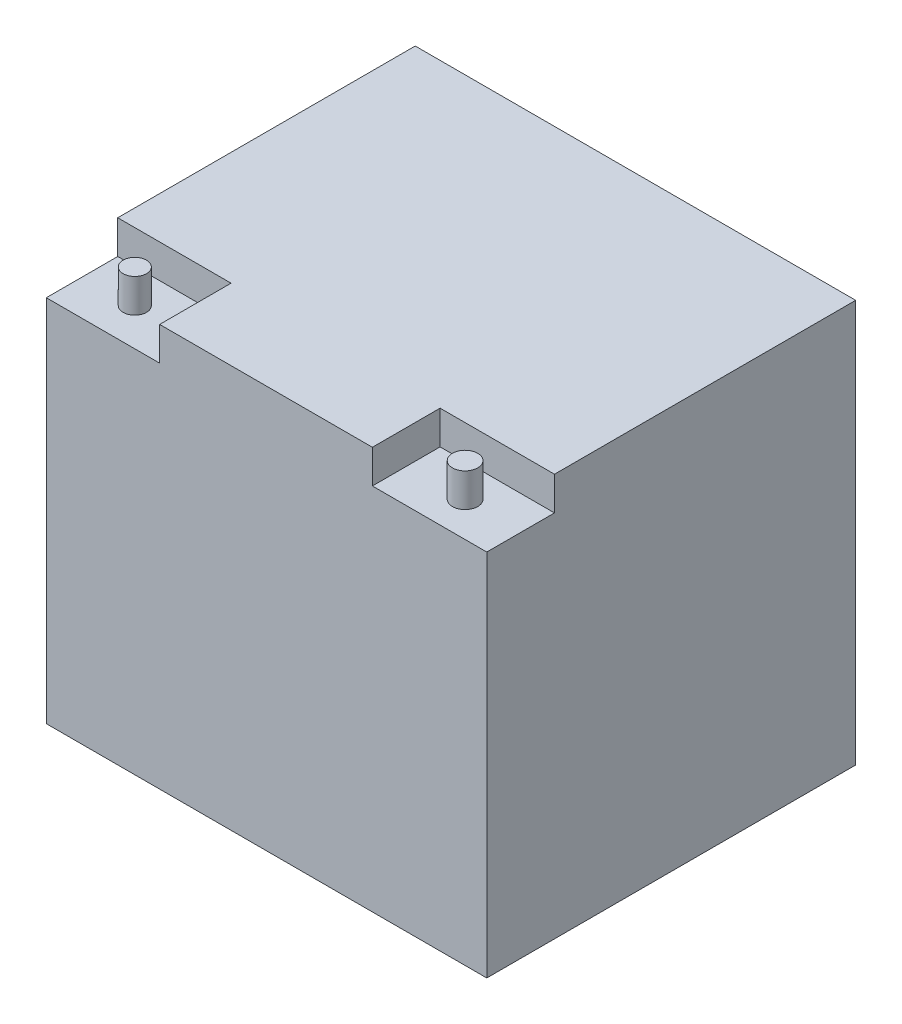
ISO-10303-21;
HEADER;
FILE_DESCRIPTION(('STEP AP214'),'2;1');
FILE_NAME('part.step','',(''),(''),'','','');
FILE_SCHEMA(('AUTOMOTIVE_DESIGN { 1 0 10303 214 1 1 1 1 }'));
ENDSEC;
DATA;
#1=APPLICATION_CONTEXT('core data for automotive mechanical design processes');
#2=APPLICATION_PROTOCOL_DEFINITION('international standard','automotive_design',2000,#1);
#3=PRODUCT_CONTEXT('',#1,'mechanical');
#4=PRODUCT('Part','Part','',(#3));
#5=PRODUCT_RELATED_PRODUCT_CATEGORY('part','',(#4));
#6=PRODUCT_DEFINITION_FORMATION('','',#4);
#7=PRODUCT_DEFINITION_CONTEXT('part definition',#1,'design');
#8=PRODUCT_DEFINITION('design','',#6,#7);
#9=PRODUCT_DEFINITION_SHAPE('','',#8);
#10=(LENGTH_UNIT() NAMED_UNIT(*) SI_UNIT(.MILLI.,.METRE.));
#11=(NAMED_UNIT(*) PLANE_ANGLE_UNIT() SI_UNIT($,.RADIAN.));
#12=(NAMED_UNIT(*) SI_UNIT($,.STERADIAN.) SOLID_ANGLE_UNIT());
#13=UNCERTAINTY_MEASURE_WITH_UNIT(LENGTH_MEASURE(1.E-05),#10,'distance_accuracy_value','');
#14=(GEOMETRIC_REPRESENTATION_CONTEXT(3) GLOBAL_UNCERTAINTY_ASSIGNED_CONTEXT((#13)) GLOBAL_UNIT_ASSIGNED_CONTEXT((#10,
#11,#12)) REPRESENTATION_CONTEXT('',''));
#15=CARTESIAN_POINT('',(0.,0.,0.));
#16=DIRECTION('',(0.,0.,1.));
#17=DIRECTION('',(1.,0.,0.));
#18=AXIS2_PLACEMENT_3D('',#15,#16,#17);
#19=CARTESIAN_POINT('',(0.,165.,0.));
#20=DIRECTION('',(0.,1.,0.));
#21=DIRECTION('',(0.,0.,1.));
#22=AXIS2_PLACEMENT_3D('',#19,#20,#21);
#23=PLANE('',#22);
#24=DIRECTION('',(0.,0.,-1.));
#25=VECTOR('',#24,1.);
#26=CARTESIAN_POINT('',(98.5,165.,82.5));
#27=LINE('',#26,#25);
#28=CARTESIAN_POINT('',(98.5,165.,82.5));
#29=VERTEX_POINT('',#28);
#30=CARTESIAN_POINT('',(98.5,165.,52.2159010639101));
#31=VERTEX_POINT('',#30);
#32=EDGE_CURVE('E122',#29,#31,#27,.T.);
#33=ORIENTED_EDGE('',*,*,#32,.T.);
#34=DIRECTION('',(-1.,0.,0.));
#35=VECTOR('',#34,1.);
#36=CARTESIAN_POINT('',(98.5,165.,52.2159010639101));
#37=LINE('',#36,#35);
#38=CARTESIAN_POINT('',(47.3392451558917,165.,52.2159010639101));
#39=VERTEX_POINT('',#38);
#40=EDGE_CURVE('E114',#31,#39,#37,.T.);
#41=ORIENTED_EDGE('',*,*,#40,.T.);
#42=DIRECTION('',(0.,0.,1.));
#43=VECTOR('',#42,1.);
#44=CARTESIAN_POINT('',(47.3392451558917,165.,82.5));
#45=LINE('',#44,#43);
#46=CARTESIAN_POINT('',(47.3392451558917,165.,82.5));
#47=VERTEX_POINT('',#46);
#48=EDGE_CURVE('E121',#39,#47,#45,.T.);
#49=ORIENTED_EDGE('',*,*,#48,.T.);
#50=DIRECTION('',(1.,0.,0.));
#51=VECTOR('',#50,1.);
#52=CARTESIAN_POINT('',(98.5,165.,82.5));
#53=LINE('',#52,#51);
#54=EDGE_CURVE('E127',#47,#29,#53,.T.);
#55=ORIENTED_EDGE('',*,*,#54,.T.);
#56=EDGE_LOOP('',(#33,#41,#49,#55));
#57=FACE_BOUND('',#56,.T.);
#58=CARTESIAN_POINT('',(73.2281311450694,165.,66.92709969892));
#59=DIRECTION('',(0.,1.,0.));
#60=DIRECTION('',(0.,0.,1.));
#61=AXIS2_PLACEMENT_3D('',#58,#59,#60);
#62=CIRCLE('',#61,5.65349857387054);
#63=CARTESIAN_POINT('',(73.2281311450694,165.,72.5805982727905));
#64=VERTEX_POINT('',#63);
#65=EDGE_CURVE('E276',#64,#64,#62,.T.);
#66=ORIENTED_EDGE('',*,*,#65,.F.);
#67=EDGE_LOOP('',(#66));
#68=FACE_BOUND('',#67,.T.);
#69=ADVANCED_FACE('F37',(#57,#68),#23,.T.);
#70=CARTESIAN_POINT('',(0.,165.,0.));
#71=DIRECTION('',(0.,-1.,0.));
#72=DIRECTION('',(0.,0.,-1.));
#73=AXIS2_PLACEMENT_3D('',#70,#71,#72);
#74=PLANE('',#73);
#75=DIRECTION('',(0.,0.,1.));
#76=VECTOR('',#75,1.);
#77=CARTESIAN_POINT('',(-98.5,165.,82.5));
#78=LINE('',#77,#76);
#79=CARTESIAN_POINT('',(-98.5,165.,50.5507014855621));
#80=VERTEX_POINT('',#79);
#81=CARTESIAN_POINT('',(-98.5,165.,82.5));
#82=VERTEX_POINT('',#81);
#83=EDGE_CURVE('E141',#80,#82,#78,.T.);
#84=ORIENTED_EDGE('',*,*,#83,.T.);
#85=DIRECTION('',(1.,0.,0.));
#86=VECTOR('',#85,1.);
#87=CARTESIAN_POINT('',(-98.5,165.,82.5));
#88=LINE('',#87,#86);
#89=CARTESIAN_POINT('',(-47.8150164639912,165.,82.5));
#90=VERTEX_POINT('',#89);
#91=EDGE_CURVE('E143',#82,#90,#88,.T.);
#92=ORIENTED_EDGE('',*,*,#91,.T.);
#93=DIRECTION('',(0.,0.,-1.));
#94=VECTOR('',#93,1.);
#95=CARTESIAN_POINT('',(-47.8150164639912,165.,82.5));
#96=LINE('',#95,#94);
#97=CARTESIAN_POINT('',(-47.8150164639912,165.,50.5507014855621));
#98=VERTEX_POINT('',#97);
#99=EDGE_CURVE('E147',#90,#98,#96,.T.);
#100=ORIENTED_EDGE('',*,*,#99,.T.);
#101=DIRECTION('',(-1.,0.,0.));
#102=VECTOR('',#101,1.);
#103=CARTESIAN_POINT('',(-98.5,165.,50.5507014855621));
#104=LINE('',#103,#102);
#105=EDGE_CURVE('E150',#98,#80,#104,.T.);
#106=ORIENTED_EDGE('',*,*,#105,.T.);
#107=EDGE_LOOP('',(#84,#92,#100,#106));
#108=FACE_BOUND('',#107,.T.);
#109=CARTESIAN_POINT('',(-75.6476379878069,165.,65.7753833447435));
#110=DIRECTION('',(0.,-1.,0.));
#111=DIRECTION('',(0.,0.,-1.));
#112=AXIS2_PLACEMENT_3D('',#109,#110,#111);
#113=CIRCLE('',#112,5.23888809150268);
#114=CARTESIAN_POINT('',(-75.6476379878069,165.,60.5364952532409));
#115=VERTEX_POINT('',#114);
#116=EDGE_CURVE('E11',#115,#115,#113,.F.);
#117=ORIENTED_EDGE('',*,*,#116,.F.);
#118=EDGE_LOOP('',(#117));
#119=FACE_BOUND('',#118,.T.);
#120=ADVANCED_FACE('F224',(#108,#119),#74,.F.);
#121=CARTESIAN_POINT('',(98.5,180.,-82.5));
#122=DIRECTION('',(-1.,0.,0.));
#123=DIRECTION('',(0.,0.,1.));
#124=AXIS2_PLACEMENT_3D('',#121,#122,#123);
#125=PLANE('',#124);
#126=DIRECTION('',(0.,0.,-1.));
#127=VECTOR('',#126,1.);
#128=CARTESIAN_POINT('',(98.5,180.,-82.5));
#129=LINE('',#128,#127);
#130=CARTESIAN_POINT('',(98.5,180.,52.2159010639101));
#131=VERTEX_POINT('',#130);
#132=CARTESIAN_POINT('',(98.5,180.,-82.5));
#133=VERTEX_POINT('',#132);
#134=EDGE_CURVE('E134',#131,#133,#129,.T.);
#135=ORIENTED_EDGE('',*,*,#134,.F.);
#136=DIRECTION('',(0.,1.,0.));
#137=VECTOR('',#136,1.);
#138=CARTESIAN_POINT('',(98.5,165.,52.2159010639101));
#139=LINE('',#138,#137);
#140=EDGE_CURVE('E52',#31,#131,#139,.T.);
#141=ORIENTED_EDGE('',*,*,#140,.F.);
#142=ORIENTED_EDGE('',*,*,#32,.F.);
#143=DIRECTION('',(0.,-1.,0.));
#144=VECTOR('',#143,1.);
#145=CARTESIAN_POINT('',(98.5,180.,82.5));
#146=LINE('',#145,#144);
#147=CARTESIAN_POINT('',(98.5,0.,82.5));
#148=VERTEX_POINT('',#147);
#149=EDGE_CURVE('E173',#29,#148,#146,.T.);
#150=ORIENTED_EDGE('',*,*,#149,.T.);
#151=DIRECTION('',(0.,0.,-1.));
#152=VECTOR('',#151,1.);
#153=CARTESIAN_POINT('',(98.5,0.,-82.5));
#154=LINE('',#153,#152);
#155=CARTESIAN_POINT('',(98.5,0.,-82.5));
#156=VERTEX_POINT('',#155);
#157=EDGE_CURVE('E159',#148,#156,#154,.T.);
#158=ORIENTED_EDGE('',*,*,#157,.T.);
#159=DIRECTION('',(0.,-1.,0.));
#160=VECTOR('',#159,1.);
#161=CARTESIAN_POINT('',(98.5,180.,-82.5));
#162=LINE('',#161,#160);
#163=EDGE_CURVE('E45',#133,#156,#162,.T.);
#164=ORIENTED_EDGE('',*,*,#163,.F.);
#165=EDGE_LOOP('',(#135,#141,#142,#150,#158,#164));
#166=FACE_BOUND('',#165,.T.);
#167=ADVANCED_FACE('F39',(#166),#125,.F.);
#168=CARTESIAN_POINT('',(-98.5000000000001,180.,-82.5));
#169=DIRECTION('',(0.,0.,1.));
#170=DIRECTION('',(1.,0.,0.));
#171=AXIS2_PLACEMENT_3D('',#168,#169,#170);
#172=PLANE('',#171);
#173=DIRECTION('',(-1.,0.,0.));
#174=VECTOR('',#173,1.);
#175=CARTESIAN_POINT('',(-98.5000000000001,0.,-82.5));
#176=LINE('',#175,#174);
#177=CARTESIAN_POINT('',(-98.5000000000001,0.,-82.5));
#178=VERTEX_POINT('',#177);
#179=EDGE_CURVE('E176',#156,#178,#176,.T.);
#180=ORIENTED_EDGE('',*,*,#179,.T.);
#181=DIRECTION('',(0.,-1.,0.));
#182=VECTOR('',#181,1.);
#183=CARTESIAN_POINT('',(-98.5000000000001,180.,-82.5));
#184=LINE('',#183,#182);
#185=CARTESIAN_POINT('',(-98.5000000000001,180.,-82.5));
#186=VERTEX_POINT('',#185);
#187=EDGE_CURVE('E186',#186,#178,#184,.T.);
#188=ORIENTED_EDGE('',*,*,#187,.F.);
#189=DIRECTION('',(-1.,0.,0.));
#190=VECTOR('',#189,1.);
#191=CARTESIAN_POINT('',(-98.5000000000001,180.,-82.5));
#192=LINE('',#191,#190);
#193=EDGE_CURVE('E164',#133,#186,#192,.T.);
#194=ORIENTED_EDGE('',*,*,#193,.F.);
#195=ORIENTED_EDGE('',*,*,#163,.T.);
#196=EDGE_LOOP('',(#180,#188,#194,#195));
#197=FACE_BOUND('',#196,.T.);
#198=ADVANCED_FACE('F191',(#197),#172,.F.);
#199=CARTESIAN_POINT('',(-98.5000000000001,180.,-82.5));
#200=DIRECTION('',(1.,0.,0.));
#201=DIRECTION('',(0.,0.,-1.));
#202=AXIS2_PLACEMENT_3D('',#199,#200,#201);
#203=PLANE('',#202);
#204=ORIENTED_EDGE('',*,*,#83,.F.);
#205=DIRECTION('',(0.,1.,0.));
#206=VECTOR('',#205,1.);
#207=CARTESIAN_POINT('',(-98.5,165.,50.5507014855621));
#208=LINE('',#207,#206);
#209=CARTESIAN_POINT('',(-98.5,180.,50.5507014855621));
#210=VERTEX_POINT('',#209);
#211=EDGE_CURVE('E156',#80,#210,#208,.T.);
#212=ORIENTED_EDGE('',*,*,#211,.T.);
#213=DIRECTION('',(0.,0.,1.));
#214=VECTOR('',#213,1.);
#215=CARTESIAN_POINT('',(-98.5000000000001,180.,-82.5));
#216=LINE('',#215,#214);
#217=EDGE_CURVE('E167',#186,#210,#216,.T.);
#218=ORIENTED_EDGE('',*,*,#217,.F.);
#219=ORIENTED_EDGE('',*,*,#187,.T.);
#220=DIRECTION('',(0.,0.,1.));
#221=VECTOR('',#220,1.);
#222=CARTESIAN_POINT('',(-98.5000000000001,0.,-82.5));
#223=LINE('',#222,#221);
#224=CARTESIAN_POINT('',(-98.5,0.,82.5));
#225=VERTEX_POINT('',#224);
#226=EDGE_CURVE('E178',#178,#225,#223,.T.);
#227=ORIENTED_EDGE('',*,*,#226,.T.);
#228=DIRECTION('',(0.,-1.,0.));
#229=VECTOR('',#228,1.);
#230=CARTESIAN_POINT('',(-98.5,180.,82.5));
#231=LINE('',#230,#229);
#232=EDGE_CURVE('E184',#82,#225,#231,.T.);
#233=ORIENTED_EDGE('',*,*,#232,.F.);
#234=EDGE_LOOP('',(#204,#212,#218,#219,#227,#233));
#235=FACE_BOUND('',#234,.T.);
#236=ADVANCED_FACE('F201',(#235),#203,.F.);
#237=CARTESIAN_POINT('',(-98.5,180.,82.5));
#238=DIRECTION('',(0.,0.,-1.));
#239=DIRECTION('',(-1.,0.,0.));
#240=AXIS2_PLACEMENT_3D('',#237,#238,#239);
#241=PLANE('',#240);
#242=ORIENTED_EDGE('',*,*,#54,.F.);
#243=DIRECTION('',(0.,1.,0.));
#244=VECTOR('',#243,1.);
#245=CARTESIAN_POINT('',(47.3392451558917,165.,82.5));
#246=LINE('',#245,#244);
#247=CARTESIAN_POINT('',(47.3392451558917,180.,82.5));
#248=VERTEX_POINT('',#247);
#249=EDGE_CURVE('E136',#47,#248,#246,.T.);
#250=ORIENTED_EDGE('',*,*,#249,.T.);
#251=DIRECTION('',(1.,0.,0.));
#252=VECTOR('',#251,1.);
#253=CARTESIAN_POINT('',(-98.5,180.,82.5));
#254=LINE('',#253,#252);
#255=CARTESIAN_POINT('',(-47.8150164639912,180.,82.5));
#256=VERTEX_POINT('',#255);
#257=EDGE_CURVE('E170',#256,#248,#254,.T.);
#258=ORIENTED_EDGE('',*,*,#257,.F.);
#259=DIRECTION('',(0.,1.,0.));
#260=VECTOR('',#259,1.);
#261=CARTESIAN_POINT('',(-47.8150164639912,165.,82.5));
#262=LINE('',#261,#260);
#263=EDGE_CURVE('E60',#90,#256,#262,.T.);
#264=ORIENTED_EDGE('',*,*,#263,.F.);
#265=ORIENTED_EDGE('',*,*,#91,.F.);
#266=ORIENTED_EDGE('',*,*,#232,.T.);
#267=DIRECTION('',(1.,0.,0.));
#268=VECTOR('',#267,1.);
#269=CARTESIAN_POINT('',(-98.5,0.,82.5));
#270=LINE('',#269,#268);
#271=EDGE_CURVE('E165',#225,#148,#270,.T.);
#272=ORIENTED_EDGE('',*,*,#271,.T.);
#273=ORIENTED_EDGE('',*,*,#149,.F.);
#274=EDGE_LOOP('',(#242,#250,#258,#264,#265,#266,#272,#273));
#275=FACE_BOUND('',#274,.T.);
#276=ADVANCED_FACE('F218',(#275),#241,.F.);
#277=CARTESIAN_POINT('',(0.,180.,0.));
#278=DIRECTION('',(0.,1.,0.));
#279=DIRECTION('',(0.,0.,1.));
#280=AXIS2_PLACEMENT_3D('',#277,#278,#279);
#281=PLANE('',#280);
#282=DIRECTION('',(0.,0.,1.));
#283=VECTOR('',#282,1.);
#284=CARTESIAN_POINT('',(47.3392451558917,180.,82.5));
#285=LINE('',#284,#283);
#286=CARTESIAN_POINT('',(47.3392451558917,180.,52.2159010639101));
#287=VERTEX_POINT('',#286);
#288=EDGE_CURVE('E130',#287,#248,#285,.T.);
#289=ORIENTED_EDGE('',*,*,#288,.F.);
#290=DIRECTION('',(-1.,0.,0.));
#291=VECTOR('',#290,1.);
#292=CARTESIAN_POINT('',(98.5,180.,52.2159010639101));
#293=LINE('',#292,#291);
#294=EDGE_CURVE('E207',#131,#287,#293,.T.);
#295=ORIENTED_EDGE('',*,*,#294,.F.);
#296=ORIENTED_EDGE('',*,*,#134,.T.);
#297=ORIENTED_EDGE('',*,*,#193,.T.);
#298=ORIENTED_EDGE('',*,*,#217,.T.);
#299=DIRECTION('',(-1.,0.,0.));
#300=VECTOR('',#299,1.);
#301=CARTESIAN_POINT('',(-98.5,180.,50.5507014855621));
#302=LINE('',#301,#300);
#303=CARTESIAN_POINT('',(-47.8150164639912,180.,50.5507014855621));
#304=VERTEX_POINT('',#303);
#305=EDGE_CURVE('E144',#304,#210,#302,.T.);
#306=ORIENTED_EDGE('',*,*,#305,.F.);
#307=DIRECTION('',(0.,0.,-1.));
#308=VECTOR('',#307,1.);
#309=CARTESIAN_POINT('',(-47.8150164639912,180.,82.5));
#310=LINE('',#309,#308);
#311=EDGE_CURVE('E153',#256,#304,#310,.T.);
#312=ORIENTED_EDGE('',*,*,#311,.F.);
#313=ORIENTED_EDGE('',*,*,#257,.T.);
#314=EDGE_LOOP('',(#289,#295,#296,#297,#298,#306,#312,#313));
#315=FACE_BOUND('',#314,.T.);
#316=ADVANCED_FACE('F206',(#315),#281,.T.);
#317=CARTESIAN_POINT('',(0.,0.,0.));
#318=DIRECTION('',(0.,1.,0.));
#319=DIRECTION('',(0.,0.,1.));
#320=AXIS2_PLACEMENT_3D('',#317,#318,#319);
#321=PLANE('',#320);
#322=ORIENTED_EDGE('',*,*,#157,.F.);
#323=ORIENTED_EDGE('',*,*,#271,.F.);
#324=ORIENTED_EDGE('',*,*,#226,.F.);
#325=ORIENTED_EDGE('',*,*,#179,.F.);
#326=EDGE_LOOP('',(#322,#323,#324,#325));
#327=FACE_BOUND('',#326,.T.);
#328=ADVANCED_FACE('F196',(#327),#321,.F.);
#329=CARTESIAN_POINT('',(-98.5,165.,50.5507014855621));
#330=DIRECTION('',(0.,0.,-1.));
#331=DIRECTION('',(-1.,0.,0.));
#332=AXIS2_PLACEMENT_3D('',#329,#330,#331);
#333=PLANE('',#332);
#334=ORIENTED_EDGE('',*,*,#305,.T.);
#335=ORIENTED_EDGE('',*,*,#211,.F.);
#336=ORIENTED_EDGE('',*,*,#105,.F.);
#337=DIRECTION('',(0.,1.,0.));
#338=VECTOR('',#337,1.);
#339=CARTESIAN_POINT('',(-47.8150164639912,165.,50.5507014855621));
#340=LINE('',#339,#338);
#341=EDGE_CURVE('E160',#98,#304,#340,.T.);
#342=ORIENTED_EDGE('',*,*,#341,.T.);
#343=EDGE_LOOP('',(#334,#335,#336,#342));
#344=FACE_BOUND('',#343,.T.);
#345=ADVANCED_FACE('F227',(#344),#333,.F.);
#346=CARTESIAN_POINT('',(-47.8150164639912,165.,82.5));
#347=DIRECTION('',(1.,0.,0.));
#348=DIRECTION('',(0.,0.,-1.));
#349=AXIS2_PLACEMENT_3D('',#346,#347,#348);
#350=PLANE('',#349);
#351=ORIENTED_EDGE('',*,*,#311,.T.);
#352=ORIENTED_EDGE('',*,*,#341,.F.);
#353=ORIENTED_EDGE('',*,*,#99,.F.);
#354=ORIENTED_EDGE('',*,*,#263,.T.);
#355=EDGE_LOOP('',(#351,#352,#353,#354));
#356=FACE_BOUND('',#355,.T.);
#357=ADVANCED_FACE('F220',(#356),#350,.F.);
#358=CARTESIAN_POINT('',(47.3392451558917,165.,82.5));
#359=DIRECTION('',(-1.,0.,0.));
#360=DIRECTION('',(0.,0.,1.));
#361=AXIS2_PLACEMENT_3D('',#358,#359,#360);
#362=PLANE('',#361);
#363=ORIENTED_EDGE('',*,*,#288,.T.);
#364=ORIENTED_EDGE('',*,*,#249,.F.);
#365=ORIENTED_EDGE('',*,*,#48,.F.);
#366=DIRECTION('',(0.,1.,0.));
#367=VECTOR('',#366,1.);
#368=CARTESIAN_POINT('',(47.3392451558917,165.,52.2159010639101));
#369=LINE('',#368,#367);
#370=EDGE_CURVE('E117',#39,#287,#369,.T.);
#371=ORIENTED_EDGE('',*,*,#370,.T.);
#372=EDGE_LOOP('',(#363,#364,#365,#371));
#373=FACE_BOUND('',#372,.T.);
#374=ADVANCED_FACE('F234',(#373),#362,.F.);
#375=CARTESIAN_POINT('',(98.5,165.,52.2159010639101));
#376=DIRECTION('',(0.,0.,-1.));
#377=DIRECTION('',(-1.,0.,0.));
#378=AXIS2_PLACEMENT_3D('',#375,#376,#377);
#379=PLANE('',#378);
#380=ORIENTED_EDGE('',*,*,#294,.T.);
#381=ORIENTED_EDGE('',*,*,#370,.F.);
#382=ORIENTED_EDGE('',*,*,#40,.F.);
#383=ORIENTED_EDGE('',*,*,#140,.T.);
#384=EDGE_LOOP('',(#380,#381,#382,#383));
#385=FACE_BOUND('',#384,.T.);
#386=ADVANCED_FACE('F116',(#385),#379,.F.);
#387=CARTESIAN_POINT('',(-75.6476379878069,180.,65.7753833447435));
#388=DIRECTION('',(0.,-1.,0.));
#389=DIRECTION('',(0.,0.,-1.));
#390=AXIS2_PLACEMENT_3D('',#387,#388,#389);
#391=CYLINDRICAL_SURFACE('',#390,5.23888809150268);
#392=CARTESIAN_POINT('',(-75.6476379878069,180.,65.7753833447435));
#393=DIRECTION('',(0.,1.,0.));
#394=DIRECTION('',(0.,0.,1.));
#395=AXIS2_PLACEMENT_3D('',#392,#393,#394);
#396=CIRCLE('',#395,5.23888809150268);
#397=CARTESIAN_POINT('',(-75.6476379878069,180.,71.0142714362462));
#398=VERTEX_POINT('',#397);
#399=EDGE_CURVE('E208',#398,#398,#396,.T.);
#400=ORIENTED_EDGE('',*,*,#399,.F.);
#401=EDGE_LOOP('',(#400));
#402=FACE_BOUND('',#401,.T.);
#403=ORIENTED_EDGE('',*,*,#116,.T.);
#404=EDGE_LOOP('',(#403));
#405=FACE_BOUND('',#404,.T.);
#406=ADVANCED_FACE('F245',(#402,#405),#391,.T.);
#407=CARTESIAN_POINT('',(-75.6476379878069,180.,65.7753833447435));
#408=DIRECTION('',(0.,1.,0.));
#409=DIRECTION('',(0.,0.,1.));
#410=AXIS2_PLACEMENT_3D('',#407,#408,#409);
#411=PLANE('',#410);
#412=ORIENTED_EDGE('',*,*,#399,.T.);
#413=EDGE_LOOP('',(#412));
#414=FACE_BOUND('',#413,.T.);
#415=ADVANCED_FACE('F253',(#414),#411,.T.);
#416=CARTESIAN_POINT('',(73.2281311450694,180.,66.92709969892));
#417=DIRECTION('',(0.,-1.,0.));
#418=DIRECTION('',(0.,0.,-1.));
#419=AXIS2_PLACEMENT_3D('',#416,#417,#418);
#420=CYLINDRICAL_SURFACE('',#419,5.65349857387054);
#421=CARTESIAN_POINT('',(73.2281311450694,180.,66.92709969892));
#422=DIRECTION('',(0.,1.,0.));
#423=DIRECTION('',(0.,0.,1.));
#424=AXIS2_PLACEMENT_3D('',#421,#422,#423);
#425=CIRCLE('',#424,5.65349857387054);
#426=CARTESIAN_POINT('',(73.2281311450694,180.,72.5805982727905));
#427=VERTEX_POINT('',#426);
#428=EDGE_CURVE('E212',#427,#427,#425,.T.);
#429=ORIENTED_EDGE('',*,*,#428,.F.);
#430=EDGE_LOOP('',(#429));
#431=FACE_BOUND('',#430,.T.);
#432=ORIENTED_EDGE('',*,*,#65,.T.);
#433=EDGE_LOOP('',(#432));
#434=FACE_BOUND('',#433,.T.);
#435=ADVANCED_FACE('F258',(#431,#434),#420,.T.);
#436=CARTESIAN_POINT('',(73.2281311450694,180.,66.92709969892));
#437=DIRECTION('',(0.,1.,0.));
#438=DIRECTION('',(0.,0.,1.));
#439=AXIS2_PLACEMENT_3D('',#436,#437,#438);
#440=PLANE('',#439);
#441=ORIENTED_EDGE('',*,*,#428,.T.);
#442=EDGE_LOOP('',(#441));
#443=FACE_BOUND('',#442,.T.);
#444=ADVANCED_FACE('F266',(#443),#440,.T.);
#445=CLOSED_SHELL('',(#69,#120,#167,#198,#236,#276,#316,#328,#345,#357,#374,#386,#406,#415,#435,#444));
#446=MANIFOLD_SOLID_BREP('B2',#445);
#447=ADVANCED_BREP_SHAPE_REPRESENTATION('',(#18,#446),#14);
#448=SHAPE_DEFINITION_REPRESENTATION(#9,#447);
ENDSEC;
END-ISO-10303-21;
